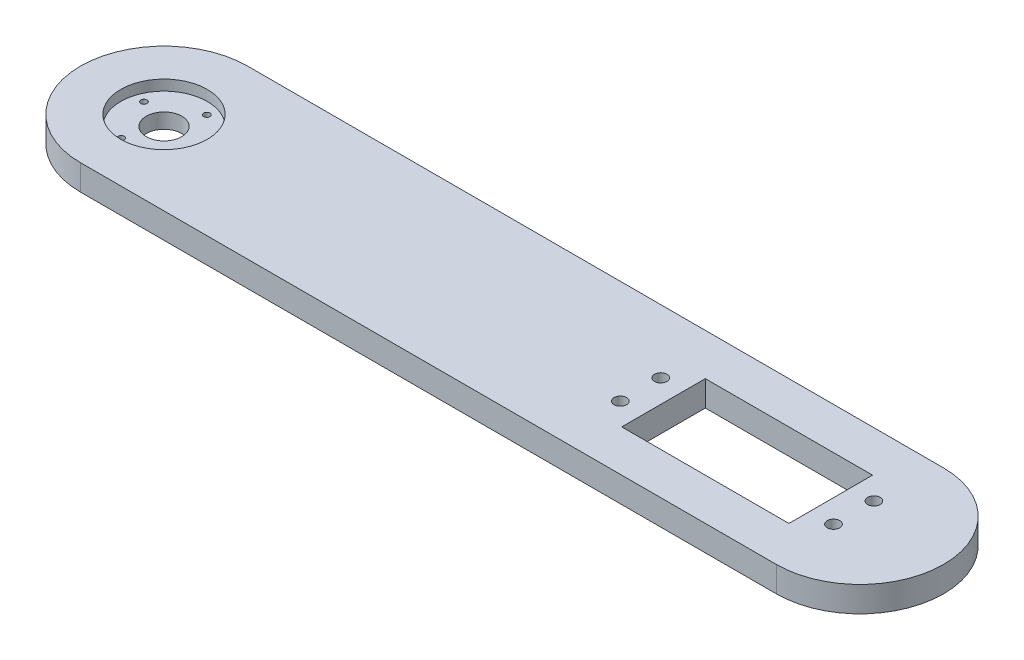
ISO-10303-21;
HEADER;
FILE_DESCRIPTION(('STEP AP214'),'2;1');
FILE_NAME('part.step','',(''),(''),'','','');
FILE_SCHEMA(('AUTOMOTIVE_DESIGN { 1 0 10303 214 1 1 1 1 }'));
ENDSEC;
DATA;
#1=APPLICATION_CONTEXT('core data for automotive mechanical design processes');
#2=APPLICATION_PROTOCOL_DEFINITION('international standard','automotive_design',2000,#1);
#3=PRODUCT_CONTEXT('',#1,'mechanical');
#4=PRODUCT('Part','Part','',(#3));
#5=PRODUCT_RELATED_PRODUCT_CATEGORY('part','',(#4));
#6=PRODUCT_DEFINITION_FORMATION('','',#4);
#7=PRODUCT_DEFINITION_CONTEXT('part definition',#1,'design');
#8=PRODUCT_DEFINITION('design','',#6,#7);
#9=PRODUCT_DEFINITION_SHAPE('','',#8);
#10=(LENGTH_UNIT() NAMED_UNIT(*) SI_UNIT(.MILLI.,.METRE.));
#11=(NAMED_UNIT(*) PLANE_ANGLE_UNIT() SI_UNIT($,.RADIAN.));
#12=(NAMED_UNIT(*) SI_UNIT($,.STERADIAN.) SOLID_ANGLE_UNIT());
#13=UNCERTAINTY_MEASURE_WITH_UNIT(LENGTH_MEASURE(1.E-05),#10,'distance_accuracy_value','');
#14=(GEOMETRIC_REPRESENTATION_CONTEXT(3) GLOBAL_UNCERTAINTY_ASSIGNED_CONTEXT((#13)) GLOBAL_UNIT_ASSIGNED_CONTEXT((#10,
#11,#12)) REPRESENTATION_CONTEXT('',''));
#15=CARTESIAN_POINT('',(0.,0.,0.));
#16=DIRECTION('',(0.,0.,1.));
#17=DIRECTION('',(1.,0.,0.));
#18=AXIS2_PLACEMENT_3D('',#15,#16,#17);
#19=CARTESIAN_POINT('',(0.,6.1,0.));
#20=DIRECTION('',(0.,-1.,0.));
#21=DIRECTION('',(0.,0.,-1.));
#22=AXIS2_PLACEMENT_3D('',#19,#20,#21);
#23=CYLINDRICAL_SURFACE('',#22,4.25);
#24=CARTESIAN_POINT('',(0.,0.,0.));
#25=DIRECTION('',(0.,1.,0.));
#26=DIRECTION('',(0.,0.,1.));
#27=AXIS2_PLACEMENT_3D('',#24,#25,#26);
#28=CIRCLE('',#27,4.25);
#29=CARTESIAN_POINT('',(0.,0.,4.25));
#30=VERTEX_POINT('',#29);
#31=EDGE_CURVE('E148',#30,#30,#28,.T.);
#32=ORIENTED_EDGE('',*,*,#31,.F.);
#33=EDGE_LOOP('',(#32));
#34=FACE_BOUND('',#33,.T.);
#35=CARTESIAN_POINT('',(0.,3.6,0.));
#36=DIRECTION('',(0.,1.,0.));
#37=DIRECTION('',(0.,0.,1.));
#38=AXIS2_PLACEMENT_3D('',#35,#36,#37);
#39=CIRCLE('',#38,4.25);
#40=CARTESIAN_POINT('',(0.,3.6,4.25));
#41=VERTEX_POINT('',#40);
#42=EDGE_CURVE('E37',#41,#41,#39,.T.);
#43=ORIENTED_EDGE('',*,*,#42,.T.);
#44=EDGE_LOOP('',(#43));
#45=FACE_BOUND('',#44,.T.);
#46=ADVANCED_FACE('F33',(#34,#45),#23,.F.);
#47=CARTESIAN_POINT('',(0.,6.1,0.));
#48=DIRECTION('',(0.,1.,0.));
#49=DIRECTION('',(0.,0.,1.));
#50=AXIS2_PLACEMENT_3D('',#47,#48,#49);
#51=PLANE('',#50);
#52=CARTESIAN_POINT('',(0.,6.1,0.));
#53=DIRECTION('',(0.,1.,0.));
#54=DIRECTION('',(0.,0.,1.));
#55=AXIS2_PLACEMENT_3D('',#52,#53,#54);
#56=CIRCLE('',#55,10.35);
#57=CARTESIAN_POINT('',(0.,6.1,10.35));
#58=VERTEX_POINT('',#57);
#59=EDGE_CURVE('E296',#58,#58,#56,.T.);
#60=ORIENTED_EDGE('',*,*,#59,.F.);
#61=EDGE_LOOP('',(#60));
#62=FACE_BOUND('',#61,.T.);
#63=CARTESIAN_POINT('',(114.,6.1,-4.825));
#64=DIRECTION('',(0.,1.,0.));
#65=DIRECTION('',(0.,0.,1.));
#66=AXIS2_PLACEMENT_3D('',#63,#64,#65);
#67=CIRCLE('',#66,1.5);
#68=CARTESIAN_POINT('',(114.,6.1,-3.325));
#69=VERTEX_POINT('',#68);
#70=EDGE_CURVE('E129',#69,#69,#67,.T.);
#71=ORIENTED_EDGE('',*,*,#70,.F.);
#72=EDGE_LOOP('',(#71));
#73=FACE_BOUND('',#72,.T.);
#74=CARTESIAN_POINT('',(165.,6.1,-4.825));
#75=DIRECTION('',(0.,1.,0.));
#76=DIRECTION('',(0.,0.,1.));
#77=AXIS2_PLACEMENT_3D('',#74,#75,#76);
#78=CIRCLE('',#77,1.5);
#79=CARTESIAN_POINT('',(165.,6.1,-3.325));
#80=VERTEX_POINT('',#79);
#81=EDGE_CURVE('E145',#80,#80,#78,.T.);
#82=ORIENTED_EDGE('',*,*,#81,.F.);
#83=EDGE_LOOP('',(#82));
#84=FACE_BOUND('',#83,.T.);
#85=CARTESIAN_POINT('',(0.,6.1,0.));
#86=DIRECTION('',(0.,1.,0.));
#87=DIRECTION('',(0.,0.,1.));
#88=AXIS2_PLACEMENT_3D('',#85,#86,#87);
#89=CIRCLE('',#88,20.);
#90=CARTESIAN_POINT('',(0.,6.1,-20.));
#91=VERTEX_POINT('',#90);
#92=CARTESIAN_POINT('',(0.,6.1,20.));
#93=VERTEX_POINT('',#92);
#94=EDGE_CURVE('E154',#91,#93,#89,.T.);
#95=ORIENTED_EDGE('',*,*,#94,.T.);
#96=DIRECTION('',(1.,0.,0.));
#97=VECTOR('',#96,1.);
#98=CARTESIAN_POINT('',(0.,6.1,20.));
#99=LINE('',#98,#97);
#100=CARTESIAN_POINT('',(166.5,6.1,20.));
#101=VERTEX_POINT('',#100);
#102=EDGE_CURVE('E157',#93,#101,#99,.T.);
#103=ORIENTED_EDGE('',*,*,#102,.T.);
#104=CARTESIAN_POINT('',(166.5,6.1,0.));
#105=DIRECTION('',(0.,1.,0.));
#106=DIRECTION('',(0.,0.,-1.));
#107=AXIS2_PLACEMENT_3D('',#104,#105,#106);
#108=CIRCLE('',#107,20.);
#109=CARTESIAN_POINT('',(166.5,6.1,-20.));
#110=VERTEX_POINT('',#109);
#111=EDGE_CURVE('E160',#101,#110,#108,.T.);
#112=ORIENTED_EDGE('',*,*,#111,.T.);
#113=DIRECTION('',(-1.,0.,0.));
#114=VECTOR('',#113,1.);
#115=CARTESIAN_POINT('',(159.5,6.1,-20.));
#116=LINE('',#115,#114);
#117=EDGE_CURVE('E162',#110,#91,#116,.T.);
#118=ORIENTED_EDGE('',*,*,#117,.T.);
#119=EDGE_LOOP('',(#95,#103,#112,#118));
#120=FACE_BOUND('',#119,.T.);
#121=CARTESIAN_POINT('',(165.,6.1,4.825));
#122=DIRECTION('',(0.,1.,0.));
#123=DIRECTION('',(0.,0.,1.));
#124=AXIS2_PLACEMENT_3D('',#121,#122,#123);
#125=CIRCLE('',#124,1.5);
#126=CARTESIAN_POINT('',(165.,6.1,6.325));
#127=VERTEX_POINT('',#126);
#128=EDGE_CURVE('E139',#127,#127,#125,.T.);
#129=ORIENTED_EDGE('',*,*,#128,.F.);
#130=EDGE_LOOP('',(#129));
#131=FACE_BOUND('',#130,.T.);
#132=DIRECTION('',(0.,0.,1.));
#133=VECTOR('',#132,1.);
#134=CARTESIAN_POINT('',(119.5,6.1,-10.));
#135=LINE('',#134,#133);
#136=CARTESIAN_POINT('',(119.5,6.1,-10.));
#137=VERTEX_POINT('',#136);
#138=CARTESIAN_POINT('',(119.5,6.1,10.));
#139=VERTEX_POINT('',#138);
#140=EDGE_CURVE('E107',#137,#139,#135,.T.);
#141=ORIENTED_EDGE('',*,*,#140,.F.);
#142=DIRECTION('',(-1.,0.,0.));
#143=VECTOR('',#142,1.);
#144=CARTESIAN_POINT('',(119.5,6.1,-10.));
#145=LINE('',#144,#143);
#146=CARTESIAN_POINT('',(159.5,6.1,-10.));
#147=VERTEX_POINT('',#146);
#148=EDGE_CURVE('E99',#147,#137,#145,.T.);
#149=ORIENTED_EDGE('',*,*,#148,.F.);
#150=DIRECTION('',(0.,0.,-1.));
#151=VECTOR('',#150,1.);
#152=CARTESIAN_POINT('',(159.5,6.1,-10.));
#153=LINE('',#152,#151);
#154=CARTESIAN_POINT('',(159.5,6.1,10.));
#155=VERTEX_POINT('',#154);
#156=EDGE_CURVE('E123',#155,#147,#153,.T.);
#157=ORIENTED_EDGE('',*,*,#156,.F.);
#158=DIRECTION('',(1.,0.,0.));
#159=VECTOR('',#158,1.);
#160=CARTESIAN_POINT('',(119.5,6.1,10.));
#161=LINE('',#160,#159);
#162=EDGE_CURVE('E121',#139,#155,#161,.T.);
#163=ORIENTED_EDGE('',*,*,#162,.F.);
#164=EDGE_LOOP('',(#141,#149,#157,#163));
#165=FACE_BOUND('',#164,.T.);
#166=CARTESIAN_POINT('',(114.,6.1,4.825));
#167=DIRECTION('',(0.,1.,0.));
#168=DIRECTION('',(0.,0.,1.));
#169=AXIS2_PLACEMENT_3D('',#166,#167,#168);
#170=CIRCLE('',#169,1.5);
#171=CARTESIAN_POINT('',(114.,6.1,6.325));
#172=VERTEX_POINT('',#171);
#173=EDGE_CURVE('E321',#172,#172,#170,.T.);
#174=ORIENTED_EDGE('',*,*,#173,.F.);
#175=EDGE_LOOP('',(#174));
#176=FACE_BOUND('',#175,.T.);
#177=ADVANCED_FACE('F119',(#62,#73,#84,#120,#131,#165,#176),#51,.T.);
#178=CARTESIAN_POINT('',(0.,0.,0.));
#179=DIRECTION('',(0.,1.,0.));
#180=DIRECTION('',(0.,0.,1.));
#181=AXIS2_PLACEMENT_3D('',#178,#179,#180);
#182=PLANE('',#181);
#183=CARTESIAN_POINT('',(-7.5250086499062,0.,-2.71555607911839));
#184=DIRECTION('',(0.,1.,0.));
#185=DIRECTION('',(0.,0.,1.));
#186=AXIS2_PLACEMENT_3D('',#183,#184,#185);
#187=CIRCLE('',#186,0.75);
#188=CARTESIAN_POINT('',(-7.5250086499062,0.,-1.96555607911839));
#189=VERTEX_POINT('',#188);
#190=EDGE_CURVE('E290',#189,#189,#187,.F.);
#191=ORIENTED_EDGE('',*,*,#190,.F.);
#192=EDGE_LOOP('',(#191));
#193=FACE_BOUND('',#192,.T.);
#194=CARTESIAN_POINT('',(7.5250086499062,0.,2.71555607911839));
#195=DIRECTION('',(0.,1.,0.));
#196=DIRECTION('',(0.,0.,1.));
#197=AXIS2_PLACEMENT_3D('',#194,#195,#196);
#198=CIRCLE('',#197,0.75);
#199=CARTESIAN_POINT('',(7.5250086499062,0.,3.46555607911839));
#200=VERTEX_POINT('',#199);
#201=EDGE_CURVE('E294',#200,#200,#198,.F.);
#202=ORIENTED_EDGE('',*,*,#201,.F.);
#203=EDGE_LOOP('',(#202));
#204=FACE_BOUND('',#203,.T.);
#205=CARTESIAN_POINT('',(-2.71555607911838,0.,7.5250086499062));
#206=DIRECTION('',(0.,1.,0.));
#207=DIRECTION('',(0.,0.,1.));
#208=AXIS2_PLACEMENT_3D('',#205,#206,#207);
#209=CIRCLE('',#208,0.75);
#210=CARTESIAN_POINT('',(-2.71555607911838,0.,8.2750086499062));
#211=VERTEX_POINT('',#210);
#212=EDGE_CURVE('E303',#211,#211,#209,.F.);
#213=ORIENTED_EDGE('',*,*,#212,.F.);
#214=EDGE_LOOP('',(#213));
#215=FACE_BOUND('',#214,.T.);
#216=CARTESIAN_POINT('',(2.71555607911839,0.,-7.5250086499062));
#217=DIRECTION('',(0.,1.,0.));
#218=DIRECTION('',(0.,0.,1.));
#219=AXIS2_PLACEMENT_3D('',#216,#217,#218);
#220=CIRCLE('',#219,0.75);
#221=CARTESIAN_POINT('',(2.71555607911839,0.,-6.7750086499062));
#222=VERTEX_POINT('',#221);
#223=EDGE_CURVE('E308',#222,#222,#220,.F.);
#224=ORIENTED_EDGE('',*,*,#223,.F.);
#225=EDGE_LOOP('',(#224));
#226=FACE_BOUND('',#225,.T.);
#227=CARTESIAN_POINT('',(165.,0.,4.825));
#228=DIRECTION('',(0.,1.,0.));
#229=DIRECTION('',(0.,0.,1.));
#230=AXIS2_PLACEMENT_3D('',#227,#228,#229);
#231=CIRCLE('',#230,1.5);
#232=CARTESIAN_POINT('',(165.,0.,6.325));
#233=VERTEX_POINT('',#232);
#234=EDGE_CURVE('E115',#233,#233,#231,.T.);
#235=ORIENTED_EDGE('',*,*,#234,.T.);
#236=EDGE_LOOP('',(#235));
#237=FACE_BOUND('',#236,.T.);
#238=CARTESIAN_POINT('',(165.,0.,-4.825));
#239=DIRECTION('',(0.,1.,0.));
#240=DIRECTION('',(0.,0.,1.));
#241=AXIS2_PLACEMENT_3D('',#238,#239,#240);
#242=CIRCLE('',#241,1.5);
#243=CARTESIAN_POINT('',(165.,0.,-3.325));
#244=VERTEX_POINT('',#243);
#245=EDGE_CURVE('E142',#244,#244,#242,.T.);
#246=ORIENTED_EDGE('',*,*,#245,.T.);
#247=EDGE_LOOP('',(#246));
#248=FACE_BOUND('',#247,.T.);
#249=ORIENTED_EDGE('',*,*,#31,.T.);
#250=EDGE_LOOP('',(#249));
#251=FACE_BOUND('',#250,.T.);
#252=CARTESIAN_POINT('',(0.,0.,0.));
#253=DIRECTION('',(0.,1.,0.));
#254=DIRECTION('',(0.,0.,1.));
#255=AXIS2_PLACEMENT_3D('',#252,#253,#254);
#256=CIRCLE('',#255,20.);
#257=CARTESIAN_POINT('',(0.,0.,-20.));
#258=VERTEX_POINT('',#257);
#259=CARTESIAN_POINT('',(0.,0.,20.));
#260=VERTEX_POINT('',#259);
#261=EDGE_CURVE('E153',#258,#260,#256,.T.);
#262=ORIENTED_EDGE('',*,*,#261,.F.);
#263=DIRECTION('',(-1.,0.,0.));
#264=VECTOR('',#263,1.);
#265=CARTESIAN_POINT('',(0.,0.,-20.));
#266=LINE('',#265,#264);
#267=CARTESIAN_POINT('',(166.5,0.,-20.));
#268=VERTEX_POINT('',#267);
#269=EDGE_CURVE('E158',#268,#258,#266,.T.);
#270=ORIENTED_EDGE('',*,*,#269,.F.);
#271=CARTESIAN_POINT('',(166.5,0.,0.));
#272=DIRECTION('',(0.,1.,0.));
#273=DIRECTION('',(0.,0.,-1.));
#274=AXIS2_PLACEMENT_3D('',#271,#272,#273);
#275=CIRCLE('',#274,20.);
#276=CARTESIAN_POINT('',(166.5,0.,20.));
#277=VERTEX_POINT('',#276);
#278=EDGE_CURVE('E169',#277,#268,#275,.T.);
#279=ORIENTED_EDGE('',*,*,#278,.F.);
#280=DIRECTION('',(1.,0.,0.));
#281=VECTOR('',#280,1.);
#282=CARTESIAN_POINT('',(166.5,0.,20.));
#283=LINE('',#282,#281);
#284=EDGE_CURVE('E167',#260,#277,#283,.T.);
#285=ORIENTED_EDGE('',*,*,#284,.F.);
#286=EDGE_LOOP('',(#262,#270,#279,#285));
#287=FACE_BOUND('',#286,.T.);
#288=DIRECTION('',(-1.,0.,0.));
#289=VECTOR('',#288,1.);
#290=CARTESIAN_POINT('',(119.5,0.,-10.));
#291=LINE('',#290,#289);
#292=CARTESIAN_POINT('',(159.5,0.,-10.));
#293=VERTEX_POINT('',#292);
#294=CARTESIAN_POINT('',(119.5,0.,-10.));
#295=VERTEX_POINT('',#294);
#296=EDGE_CURVE('E57',#293,#295,#291,.T.);
#297=ORIENTED_EDGE('',*,*,#296,.T.);
#298=DIRECTION('',(0.,0.,1.));
#299=VECTOR('',#298,1.);
#300=CARTESIAN_POINT('',(119.5,0.,-10.));
#301=LINE('',#300,#299);
#302=CARTESIAN_POINT('',(119.5,0.,10.));
#303=VERTEX_POINT('',#302);
#304=EDGE_CURVE('E114',#295,#303,#301,.T.);
#305=ORIENTED_EDGE('',*,*,#304,.T.);
#306=DIRECTION('',(1.,0.,0.));
#307=VECTOR('',#306,1.);
#308=CARTESIAN_POINT('',(119.5,0.,10.));
#309=LINE('',#308,#307);
#310=CARTESIAN_POINT('',(159.5,0.,10.));
#311=VERTEX_POINT('',#310);
#312=EDGE_CURVE('E131',#303,#311,#309,.T.);
#313=ORIENTED_EDGE('',*,*,#312,.T.);
#314=DIRECTION('',(0.,0.,-1.));
#315=VECTOR('',#314,1.);
#316=CARTESIAN_POINT('',(159.5,0.,-10.));
#317=LINE('',#316,#315);
#318=EDGE_CURVE('E108',#311,#293,#317,.T.);
#319=ORIENTED_EDGE('',*,*,#318,.T.);
#320=EDGE_LOOP('',(#297,#305,#313,#319));
#321=FACE_BOUND('',#320,.T.);
#322=CARTESIAN_POINT('',(114.,0.,-4.825));
#323=DIRECTION('',(0.,1.,0.));
#324=DIRECTION('',(0.,0.,1.));
#325=AXIS2_PLACEMENT_3D('',#322,#323,#324);
#326=CIRCLE('',#325,1.5);
#327=CARTESIAN_POINT('',(114.,0.,-3.325));
#328=VERTEX_POINT('',#327);
#329=EDGE_CURVE('E324',#328,#328,#326,.T.);
#330=ORIENTED_EDGE('',*,*,#329,.T.);
#331=EDGE_LOOP('',(#330));
#332=FACE_BOUND('',#331,.T.);
#333=CARTESIAN_POINT('',(114.,0.,4.825));
#334=DIRECTION('',(0.,1.,0.));
#335=DIRECTION('',(0.,0.,1.));
#336=AXIS2_PLACEMENT_3D('',#333,#334,#335);
#337=CIRCLE('',#336,1.5);
#338=CARTESIAN_POINT('',(114.,0.,6.325));
#339=VERTEX_POINT('',#338);
#340=EDGE_CURVE('E325',#339,#339,#337,.T.);
#341=ORIENTED_EDGE('',*,*,#340,.T.);
#342=EDGE_LOOP('',(#341));
#343=FACE_BOUND('',#342,.T.);
#344=ADVANCED_FACE('F188',(#193,#204,#215,#226,#237,#248,#251,#287,#321,#332,#343),#182,.F.);
#345=CARTESIAN_POINT('',(0.,6.1,0.));
#346=DIRECTION('',(0.,-1.,0.));
#347=DIRECTION('',(0.,0.,-1.));
#348=AXIS2_PLACEMENT_3D('',#345,#346,#347);
#349=CYLINDRICAL_SURFACE('',#348,20.);
#350=ORIENTED_EDGE('',*,*,#261,.T.);
#351=DIRECTION('',(0.,-1.,0.));
#352=VECTOR('',#351,1.);
#353=CARTESIAN_POINT('',(0.,6.1,20.));
#354=LINE('',#353,#352);
#355=EDGE_CURVE('E11',#93,#260,#354,.T.);
#356=ORIENTED_EDGE('',*,*,#355,.F.);
#357=ORIENTED_EDGE('',*,*,#94,.F.);
#358=DIRECTION('',(0.,-1.,0.));
#359=VECTOR('',#358,1.);
#360=CARTESIAN_POINT('',(0.,6.1,-20.));
#361=LINE('',#360,#359);
#362=EDGE_CURVE('E164',#91,#258,#361,.T.);
#363=ORIENTED_EDGE('',*,*,#362,.T.);
#364=EDGE_LOOP('',(#350,#356,#357,#363));
#365=FACE_BOUND('',#364,.T.);
#366=ADVANCED_FACE('F35',(#365),#349,.T.);
#367=CARTESIAN_POINT('',(166.5,6.1,20.));
#368=DIRECTION('',(0.,0.,-1.));
#369=DIRECTION('',(-1.,0.,0.));
#370=AXIS2_PLACEMENT_3D('',#367,#368,#369);
#371=PLANE('',#370);
#372=ORIENTED_EDGE('',*,*,#284,.T.);
#373=DIRECTION('',(0.,-1.,0.));
#374=VECTOR('',#373,1.);
#375=CARTESIAN_POINT('',(166.5,6.1,20.));
#376=LINE('',#375,#374);
#377=EDGE_CURVE('E42',#101,#277,#376,.T.);
#378=ORIENTED_EDGE('',*,*,#377,.F.);
#379=ORIENTED_EDGE('',*,*,#102,.F.);
#380=ORIENTED_EDGE('',*,*,#355,.T.);
#381=EDGE_LOOP('',(#372,#378,#379,#380));
#382=FACE_BOUND('',#381,.T.);
#383=ADVANCED_FACE('F199',(#382),#371,.F.);
#384=CARTESIAN_POINT('',(166.5,6.1,0.));
#385=DIRECTION('',(0.,-1.,0.));
#386=DIRECTION('',(0.,0.,-1.));
#387=AXIS2_PLACEMENT_3D('',#384,#385,#386);
#388=CYLINDRICAL_SURFACE('',#387,20.);
#389=ORIENTED_EDGE('',*,*,#278,.T.);
#390=DIRECTION('',(0.,-1.,0.));
#391=VECTOR('',#390,1.);
#392=CARTESIAN_POINT('',(166.5,6.1,-20.));
#393=LINE('',#392,#391);
#394=EDGE_CURVE('E175',#110,#268,#393,.T.);
#395=ORIENTED_EDGE('',*,*,#394,.F.);
#396=ORIENTED_EDGE('',*,*,#111,.F.);
#397=ORIENTED_EDGE('',*,*,#377,.T.);
#398=EDGE_LOOP('',(#389,#395,#396,#397));
#399=FACE_BOUND('',#398,.T.);
#400=ADVANCED_FACE('F183',(#399),#388,.T.);
#401=CARTESIAN_POINT('',(0.,6.1,-20.));
#402=DIRECTION('',(0.,0.,1.));
#403=DIRECTION('',(1.,0.,0.));
#404=AXIS2_PLACEMENT_3D('',#401,#402,#403);
#405=PLANE('',#404);
#406=ORIENTED_EDGE('',*,*,#269,.T.);
#407=ORIENTED_EDGE('',*,*,#362,.F.);
#408=ORIENTED_EDGE('',*,*,#117,.F.);
#409=ORIENTED_EDGE('',*,*,#394,.T.);
#410=EDGE_LOOP('',(#406,#407,#408,#409));
#411=FACE_BOUND('',#410,.T.);
#412=ADVANCED_FACE('F192',(#411),#405,.F.);
#413=CARTESIAN_POINT('',(165.,6.1,-4.825));
#414=DIRECTION('',(0.,-1.,0.));
#415=DIRECTION('',(0.,0.,-1.));
#416=AXIS2_PLACEMENT_3D('',#413,#414,#415);
#417=CYLINDRICAL_SURFACE('',#416,1.5);
#418=ORIENTED_EDGE('',*,*,#81,.T.);
#419=EDGE_LOOP('',(#418));
#420=FACE_BOUND('',#419,.T.);
#421=ORIENTED_EDGE('',*,*,#245,.F.);
#422=EDGE_LOOP('',(#421));
#423=FACE_BOUND('',#422,.T.);
#424=ADVANCED_FACE('F217',(#420,#423),#417,.F.);
#425=CARTESIAN_POINT('',(165.,6.1,4.825));
#426=DIRECTION('',(0.,-1.,0.));
#427=DIRECTION('',(0.,0.,-1.));
#428=AXIS2_PLACEMENT_3D('',#425,#426,#427);
#429=CYLINDRICAL_SURFACE('',#428,1.5);
#430=ORIENTED_EDGE('',*,*,#128,.T.);
#431=EDGE_LOOP('',(#430));
#432=FACE_BOUND('',#431,.T.);
#433=ORIENTED_EDGE('',*,*,#234,.F.);
#434=EDGE_LOOP('',(#433));
#435=FACE_BOUND('',#434,.T.);
#436=ADVANCED_FACE('F227',(#432,#435),#429,.F.);
#437=CARTESIAN_POINT('',(119.5,6.1,-10.));
#438=DIRECTION('',(0.,0.,1.));
#439=DIRECTION('',(1.,0.,0.));
#440=AXIS2_PLACEMENT_3D('',#437,#438,#439);
#441=PLANE('',#440);
#442=ORIENTED_EDGE('',*,*,#296,.F.);
#443=DIRECTION('',(0.,-1.,0.));
#444=VECTOR('',#443,1.);
#445=CARTESIAN_POINT('',(159.5,6.1,-10.));
#446=LINE('',#445,#444);
#447=EDGE_CURVE('E103',#147,#293,#446,.T.);
#448=ORIENTED_EDGE('',*,*,#447,.F.);
#449=ORIENTED_EDGE('',*,*,#148,.T.);
#450=DIRECTION('',(0.,-1.,0.));
#451=VECTOR('',#450,1.);
#452=CARTESIAN_POINT('',(119.5,6.1,-10.));
#453=LINE('',#452,#451);
#454=EDGE_CURVE('E102',#137,#295,#453,.T.);
#455=ORIENTED_EDGE('',*,*,#454,.T.);
#456=EDGE_LOOP('',(#442,#448,#449,#455));
#457=FACE_BOUND('',#456,.T.);
#458=ADVANCED_FACE('F101',(#457),#441,.T.);
#459=CARTESIAN_POINT('',(119.5,6.1,-10.));
#460=DIRECTION('',(1.,0.,0.));
#461=DIRECTION('',(0.,0.,-1.));
#462=AXIS2_PLACEMENT_3D('',#459,#460,#461);
#463=PLANE('',#462);
#464=ORIENTED_EDGE('',*,*,#304,.F.);
#465=ORIENTED_EDGE('',*,*,#454,.F.);
#466=ORIENTED_EDGE('',*,*,#140,.T.);
#467=DIRECTION('',(0.,-1.,0.));
#468=VECTOR('',#467,1.);
#469=CARTESIAN_POINT('',(119.5,6.1,10.));
#470=LINE('',#469,#468);
#471=EDGE_CURVE('E116',#139,#303,#470,.T.);
#472=ORIENTED_EDGE('',*,*,#471,.T.);
#473=EDGE_LOOP('',(#464,#465,#466,#472));
#474=FACE_BOUND('',#473,.T.);
#475=ADVANCED_FACE('F111',(#474),#463,.T.);
#476=CARTESIAN_POINT('',(119.5,6.1,10.));
#477=DIRECTION('',(0.,0.,-1.));
#478=DIRECTION('',(-1.,0.,0.));
#479=AXIS2_PLACEMENT_3D('',#476,#477,#478);
#480=PLANE('',#479);
#481=ORIENTED_EDGE('',*,*,#312,.F.);
#482=ORIENTED_EDGE('',*,*,#471,.F.);
#483=ORIENTED_EDGE('',*,*,#162,.T.);
#484=DIRECTION('',(0.,-1.,0.));
#485=VECTOR('',#484,1.);
#486=CARTESIAN_POINT('',(159.5,6.1,10.));
#487=LINE('',#486,#485);
#488=EDGE_CURVE('E49',#155,#311,#487,.T.);
#489=ORIENTED_EDGE('',*,*,#488,.T.);
#490=EDGE_LOOP('',(#481,#482,#483,#489));
#491=FACE_BOUND('',#490,.T.);
#492=ADVANCED_FACE('F247',(#491),#480,.T.);
#493=CARTESIAN_POINT('',(159.5,6.1,-10.));
#494=DIRECTION('',(-1.,0.,0.));
#495=DIRECTION('',(0.,0.,1.));
#496=AXIS2_PLACEMENT_3D('',#493,#494,#495);
#497=PLANE('',#496);
#498=ORIENTED_EDGE('',*,*,#318,.F.);
#499=ORIENTED_EDGE('',*,*,#488,.F.);
#500=ORIENTED_EDGE('',*,*,#156,.T.);
#501=ORIENTED_EDGE('',*,*,#447,.T.);
#502=EDGE_LOOP('',(#498,#499,#500,#501));
#503=FACE_BOUND('',#502,.T.);
#504=ADVANCED_FACE('F250',(#503),#497,.T.);
#505=CARTESIAN_POINT('',(114.,6.1,-4.825));
#506=DIRECTION('',(0.,-1.,0.));
#507=DIRECTION('',(0.,0.,-1.));
#508=AXIS2_PLACEMENT_3D('',#505,#506,#507);
#509=CYLINDRICAL_SURFACE('',#508,1.5);
#510=ORIENTED_EDGE('',*,*,#70,.T.);
#511=EDGE_LOOP('',(#510));
#512=FACE_BOUND('',#511,.T.);
#513=ORIENTED_EDGE('',*,*,#329,.F.);
#514=EDGE_LOOP('',(#513));
#515=FACE_BOUND('',#514,.T.);
#516=ADVANCED_FACE('F254',(#512,#515),#509,.F.);
#517=CARTESIAN_POINT('',(114.,6.1,4.825));
#518=DIRECTION('',(0.,-1.,0.));
#519=DIRECTION('',(0.,0.,-1.));
#520=AXIS2_PLACEMENT_3D('',#517,#518,#519);
#521=CYLINDRICAL_SURFACE('',#520,1.5);
#522=ORIENTED_EDGE('',*,*,#173,.T.);
#523=EDGE_LOOP('',(#522));
#524=FACE_BOUND('',#523,.T.);
#525=ORIENTED_EDGE('',*,*,#340,.F.);
#526=EDGE_LOOP('',(#525));
#527=FACE_BOUND('',#526,.T.);
#528=ADVANCED_FACE('F257',(#524,#527),#521,.F.);
#529=CARTESIAN_POINT('',(0.,3.6,0.));
#530=DIRECTION('',(0.,1.,0.));
#531=DIRECTION('',(0.,0.,1.));
#532=AXIS2_PLACEMENT_3D('',#529,#530,#531);
#533=CYLINDRICAL_SURFACE('',#532,10.35);
#534=CARTESIAN_POINT('',(0.,3.6,0.));
#535=DIRECTION('',(0.,1.,0.));
#536=DIRECTION('',(0.,0.,1.));
#537=AXIS2_PLACEMENT_3D('',#534,#535,#536);
#538=CIRCLE('',#537,10.35);
#539=CARTESIAN_POINT('',(0.,3.6,10.35));
#540=VERTEX_POINT('',#539);
#541=EDGE_CURVE('E316',#540,#540,#538,.T.);
#542=ORIENTED_EDGE('',*,*,#541,.F.);
#543=EDGE_LOOP('',(#542));
#544=FACE_BOUND('',#543,.T.);
#545=ORIENTED_EDGE('',*,*,#59,.T.);
#546=EDGE_LOOP('',(#545));
#547=FACE_BOUND('',#546,.T.);
#548=ADVANCED_FACE('F261',(#544,#547),#533,.F.);
#549=CARTESIAN_POINT('',(0.,3.6,0.));
#550=DIRECTION('',(0.,1.,0.));
#551=DIRECTION('',(0.,0.,1.));
#552=AXIS2_PLACEMENT_3D('',#549,#550,#551);
#553=PLANE('',#552);
#554=CARTESIAN_POINT('',(-7.5250086499062,3.6,-2.71555607911839));
#555=DIRECTION('',(0.,1.,0.));
#556=DIRECTION('',(0.,0.,1.));
#557=AXIS2_PLACEMENT_3D('',#554,#555,#556);
#558=CIRCLE('',#557,0.75);
#559=CARTESIAN_POINT('',(-7.5250086499062,3.6,-1.96555607911839));
#560=VERTEX_POINT('',#559);
#561=EDGE_CURVE('E293',#560,#560,#558,.T.);
#562=ORIENTED_EDGE('',*,*,#561,.F.);
#563=EDGE_LOOP('',(#562));
#564=FACE_BOUND('',#563,.T.);
#565=CARTESIAN_POINT('',(7.5250086499062,3.6,2.71555607911839));
#566=DIRECTION('',(0.,1.,0.));
#567=DIRECTION('',(0.,0.,1.));
#568=AXIS2_PLACEMENT_3D('',#565,#566,#567);
#569=CIRCLE('',#568,0.75);
#570=CARTESIAN_POINT('',(7.5250086499062,3.6,3.46555607911839));
#571=VERTEX_POINT('',#570);
#572=EDGE_CURVE('E299',#571,#571,#569,.T.);
#573=ORIENTED_EDGE('',*,*,#572,.F.);
#574=EDGE_LOOP('',(#573));
#575=FACE_BOUND('',#574,.T.);
#576=CARTESIAN_POINT('',(-2.71555607911838,3.6,7.5250086499062));
#577=DIRECTION('',(0.,1.,0.));
#578=DIRECTION('',(0.,0.,1.));
#579=AXIS2_PLACEMENT_3D('',#576,#577,#578);
#580=CIRCLE('',#579,0.75);
#581=CARTESIAN_POINT('',(-2.71555607911838,3.6,8.2750086499062));
#582=VERTEX_POINT('',#581);
#583=EDGE_CURVE('E305',#582,#582,#580,.T.);
#584=ORIENTED_EDGE('',*,*,#583,.F.);
#585=EDGE_LOOP('',(#584));
#586=FACE_BOUND('',#585,.T.);
#587=CARTESIAN_POINT('',(2.71555607911839,3.6,-7.5250086499062));
#588=DIRECTION('',(0.,1.,0.));
#589=DIRECTION('',(0.,0.,1.));
#590=AXIS2_PLACEMENT_3D('',#587,#588,#589);
#591=CIRCLE('',#590,0.75);
#592=CARTESIAN_POINT('',(2.71555607911839,3.6,-6.7750086499062));
#593=VERTEX_POINT('',#592);
#594=EDGE_CURVE('E311',#593,#593,#591,.T.);
#595=ORIENTED_EDGE('',*,*,#594,.F.);
#596=EDGE_LOOP('',(#595));
#597=FACE_BOUND('',#596,.T.);
#598=ORIENTED_EDGE('',*,*,#42,.F.);
#599=EDGE_LOOP('',(#598));
#600=FACE_BOUND('',#599,.T.);
#601=ORIENTED_EDGE('',*,*,#541,.T.);
#602=EDGE_LOOP('',(#601));
#603=FACE_BOUND('',#602,.T.);
#604=ADVANCED_FACE('F265',(#564,#575,#586,#597,#600,#603),#553,.T.);
#605=CARTESIAN_POINT('',(2.71555607911839,-2.12132034355964,-7.5250086499062));
#606=DIRECTION('',(0.,1.,0.));
#607=DIRECTION('',(0.,0.,1.));
#608=AXIS2_PLACEMENT_3D('',#605,#606,#607);
#609=CYLINDRICAL_SURFACE('',#608,0.75);
#610=ORIENTED_EDGE('',*,*,#223,.T.);
#611=EDGE_LOOP('',(#610));
#612=FACE_BOUND('',#611,.T.);
#613=ORIENTED_EDGE('',*,*,#594,.T.);
#614=EDGE_LOOP('',(#613));
#615=FACE_BOUND('',#614,.T.);
#616=ADVANCED_FACE('F269',(#612,#615),#609,.F.);
#617=CARTESIAN_POINT('',(-2.71555607911838,-2.12132034355964,7.5250086499062));
#618=DIRECTION('',(0.,1.,0.));
#619=DIRECTION('',(0.,0.,1.));
#620=AXIS2_PLACEMENT_3D('',#617,#618,#619);
#621=CYLINDRICAL_SURFACE('',#620,0.75);
#622=ORIENTED_EDGE('',*,*,#212,.T.);
#623=EDGE_LOOP('',(#622));
#624=FACE_BOUND('',#623,.T.);
#625=ORIENTED_EDGE('',*,*,#583,.T.);
#626=EDGE_LOOP('',(#625));
#627=FACE_BOUND('',#626,.T.);
#628=ADVANCED_FACE('F273',(#624,#627),#621,.F.);
#629=CARTESIAN_POINT('',(7.5250086499062,-2.12132034355964,2.71555607911839));
#630=DIRECTION('',(0.,1.,0.));
#631=DIRECTION('',(0.,0.,1.));
#632=AXIS2_PLACEMENT_3D('',#629,#630,#631);
#633=CYLINDRICAL_SURFACE('',#632,0.75);
#634=ORIENTED_EDGE('',*,*,#201,.T.);
#635=EDGE_LOOP('',(#634));
#636=FACE_BOUND('',#635,.T.);
#637=ORIENTED_EDGE('',*,*,#572,.T.);
#638=EDGE_LOOP('',(#637));
#639=FACE_BOUND('',#638,.T.);
#640=ADVANCED_FACE('F277',(#636,#639),#633,.F.);
#641=CARTESIAN_POINT('',(-7.5250086499062,-2.12132034355964,-2.71555607911839));
#642=DIRECTION('',(0.,1.,0.));
#643=DIRECTION('',(0.,0.,1.));
#644=AXIS2_PLACEMENT_3D('',#641,#642,#643);
#645=CYLINDRICAL_SURFACE('',#644,0.75);
#646=ORIENTED_EDGE('',*,*,#190,.T.);
#647=EDGE_LOOP('',(#646));
#648=FACE_BOUND('',#647,.T.);
#649=ORIENTED_EDGE('',*,*,#561,.T.);
#650=EDGE_LOOP('',(#649));
#651=FACE_BOUND('',#650,.T.);
#652=ADVANCED_FACE('F281',(#648,#651),#645,.F.);
#653=CLOSED_SHELL('',(#46,#177,#344,#366,#383,#400,#412,#424,#436,#458,#475,#492,#504,#516,#528,
#548,#604,#616,#628,#640,#652));
#654=MANIFOLD_SOLID_BREP('B2',#653);
#655=ADVANCED_BREP_SHAPE_REPRESENTATION('',(#18,#654),#14);
#656=SHAPE_DEFINITION_REPRESENTATION(#9,#655);
ENDSEC;
END-ISO-10303-21;
